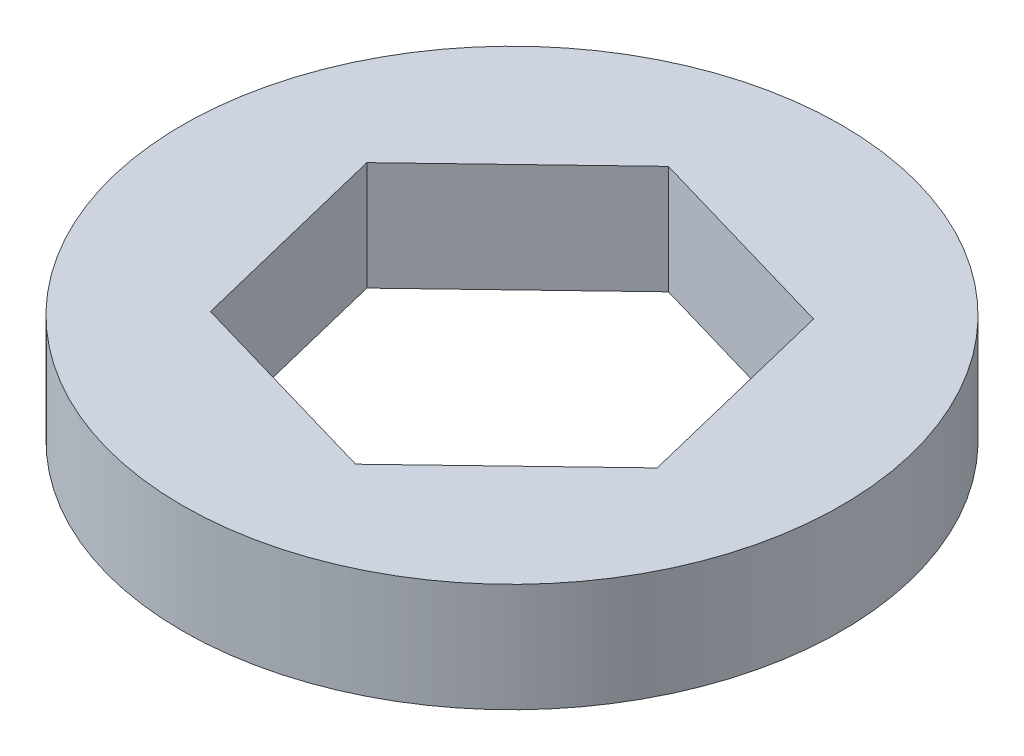
ISO-10303-21;
HEADER;
FILE_DESCRIPTION(('STEP AP214'),'2;1');
FILE_NAME('part.step','',(''),(''),'','','');
FILE_SCHEMA(('AUTOMOTIVE_DESIGN { 1 0 10303 214 1 1 1 1 }'));
ENDSEC;
DATA;
#1=APPLICATION_CONTEXT('core data for automotive mechanical design processes');
#2=APPLICATION_PROTOCOL_DEFINITION('international standard','automotive_design',2000,#1);
#3=PRODUCT_CONTEXT('',#1,'mechanical');
#4=PRODUCT('Part','Part','',(#3));
#5=PRODUCT_RELATED_PRODUCT_CATEGORY('part','',(#4));
#6=PRODUCT_DEFINITION_FORMATION('','',#4);
#7=PRODUCT_DEFINITION_CONTEXT('part definition',#1,'design');
#8=PRODUCT_DEFINITION('design','',#6,#7);
#9=PRODUCT_DEFINITION_SHAPE('','',#8);
#10=(LENGTH_UNIT() NAMED_UNIT(*) SI_UNIT(.MILLI.,.METRE.));
#11=(NAMED_UNIT(*) PLANE_ANGLE_UNIT() SI_UNIT($,.RADIAN.));
#12=(NAMED_UNIT(*) SI_UNIT($,.STERADIAN.) SOLID_ANGLE_UNIT());
#13=UNCERTAINTY_MEASURE_WITH_UNIT(LENGTH_MEASURE(1.E-05),#10,'distance_accuracy_value','');
#14=(GEOMETRIC_REPRESENTATION_CONTEXT(3) GLOBAL_UNCERTAINTY_ASSIGNED_CONTEXT((#13)) GLOBAL_UNIT_ASSIGNED_CONTEXT((#10,
#11,#12)) REPRESENTATION_CONTEXT('',''));
#15=CARTESIAN_POINT('',(0.,0.,0.));
#16=DIRECTION('',(0.,0.,1.));
#17=DIRECTION('',(1.,0.,0.));
#18=AXIS2_PLACEMENT_3D('',#15,#16,#17);
#19=CARTESIAN_POINT('',(0.,1.5,0.));
#20=DIRECTION('',(0.,-1.,0.));
#21=DIRECTION('',(0.,0.,-1.));
#22=AXIS2_PLACEMENT_3D('',#19,#20,#21);
#23=CYLINDRICAL_SURFACE('',#22,4.55);
#24=CARTESIAN_POINT('',(0.,1.5,0.));
#25=DIRECTION('',(0.,1.,0.));
#26=DIRECTION('',(0.,0.,1.));
#27=AXIS2_PLACEMENT_3D('',#24,#25,#26);
#28=CIRCLE('',#27,4.55);
#29=CARTESIAN_POINT('',(0.,1.5,4.55));
#30=VERTEX_POINT('',#29);
#31=EDGE_CURVE('E125',#30,#30,#28,.T.);
#32=ORIENTED_EDGE('',*,*,#31,.F.);
#33=EDGE_LOOP('',(#32));
#34=FACE_BOUND('',#33,.T.);
#35=CARTESIAN_POINT('',(0.,0.,0.));
#36=DIRECTION('',(0.,1.,0.));
#37=DIRECTION('',(0.,0.,1.));
#38=AXIS2_PLACEMENT_3D('',#35,#36,#37);
#39=CIRCLE('',#38,4.55);
#40=CARTESIAN_POINT('',(0.,0.,4.55));
#41=VERTEX_POINT('',#40);
#42=EDGE_CURVE('E118',#41,#41,#39,.T.);
#43=ORIENTED_EDGE('',*,*,#42,.T.);
#44=EDGE_LOOP('',(#43));
#45=FACE_BOUND('',#44,.T.);
#46=ADVANCED_FACE('F33',(#34,#45),#23,.T.);
#47=CARTESIAN_POINT('',(0.,1.5,0.));
#48=DIRECTION('',(0.,1.,0.));
#49=DIRECTION('',(0.,0.,1.));
#50=AXIS2_PLACEMENT_3D('',#47,#48,#49);
#51=PLANE('',#50);
#52=DIRECTION('',(0.237991419769063,0.,0.971267256792025));
#53=VECTOR('',#52,1.);
#54=CARTESIAN_POINT('',(-2.82711275100431,1.5,-0.82306348060695));
#55=LINE('',#54,#53);
#56=CARTESIAN_POINT('',(-2.82711275100431,1.5,-0.82306348060695));
#57=VERTEX_POINT('',#56);
#58=CARTESIAN_POINT('',(-2.12635025863502,1.5,2.03681972142917));
#59=VERTEX_POINT('',#58);
#60=EDGE_CURVE('E47',#57,#59,#55,.T.);
#61=ORIENTED_EDGE('',*,*,#60,.F.);
#62=DIRECTION('',(-0.722146408361386,0.,0.691740243798747));
#63=VECTOR('',#62,1.);
#64=CARTESIAN_POINT('',(-0.700762492369296,1.5,-2.85988320203612));
#65=LINE('',#64,#63);
#66=CARTESIAN_POINT('',(-0.700762492369296,1.5,-2.85988320203612));
#67=VERTEX_POINT('',#66);
#68=EDGE_CURVE('E113',#67,#57,#65,.T.);
#69=ORIENTED_EDGE('',*,*,#68,.F.);
#70=DIRECTION('',(-0.960137828130449,0.,-0.279527012993278));
#71=VECTOR('',#70,1.);
#72=CARTESIAN_POINT('',(2.12635025863501,1.5,-2.03681972142917));
#73=LINE('',#72,#71);
#74=CARTESIAN_POINT('',(2.12635025863501,1.5,-2.03681972142917));
#75=VERTEX_POINT('',#74);
#76=EDGE_CURVE('E107',#75,#67,#73,.T.);
#77=ORIENTED_EDGE('',*,*,#76,.F.);
#78=DIRECTION('',(-0.237991419769063,0.,-0.971267256792025));
#79=VECTOR('',#78,1.);
#80=CARTESIAN_POINT('',(2.82711275100431,1.5,0.823063480606951));
#81=LINE('',#80,#79);
#82=CARTESIAN_POINT('',(2.82711275100431,1.5,0.823063480606951));
#83=VERTEX_POINT('',#82);
#84=EDGE_CURVE('E105',#83,#75,#81,.T.);
#85=ORIENTED_EDGE('',*,*,#84,.F.);
#86=DIRECTION('',(0.722146408361386,0.,-0.691740243798747));
#87=VECTOR('',#86,1.);
#88=CARTESIAN_POINT('',(0.700762492369297,1.5,2.85988320203612));
#89=LINE('',#88,#87);
#90=CARTESIAN_POINT('',(0.700762492369297,1.5,2.85988320203612));
#91=VERTEX_POINT('',#90);
#92=EDGE_CURVE('E88',#91,#83,#89,.T.);
#93=ORIENTED_EDGE('',*,*,#92,.F.);
#94=DIRECTION('',(0.960137828130449,0.,0.279527012993278));
#95=VECTOR('',#94,1.);
#96=CARTESIAN_POINT('',(-2.12635025863502,1.5,2.03681972142917));
#97=LINE('',#96,#95);
#98=EDGE_CURVE('E97',#59,#91,#97,.T.);
#99=ORIENTED_EDGE('',*,*,#98,.F.);
#100=EDGE_LOOP('',(#61,#69,#77,#85,#93,#99));
#101=FACE_BOUND('',#100,.T.);
#102=ORIENTED_EDGE('',*,*,#31,.T.);
#103=EDGE_LOOP('',(#102));
#104=FACE_BOUND('',#103,.T.);
#105=ADVANCED_FACE('F101',(#101,#104),#51,.T.);
#106=CARTESIAN_POINT('',(0.,0.,0.));
#107=DIRECTION('',(0.,1.,0.));
#108=DIRECTION('',(0.,0.,1.));
#109=AXIS2_PLACEMENT_3D('',#106,#107,#108);
#110=PLANE('',#109);
#111=DIRECTION('',(-0.722146408361387,0.,0.691740243798747));
#112=VECTOR('',#111,1.);
#113=CARTESIAN_POINT('',(-1.7639376216868,0.,-1.84147334132154));
#114=LINE('',#113,#112);
#115=CARTESIAN_POINT('',(-0.700762492369296,0.,-2.85988320203612));
#116=VERTEX_POINT('',#115);
#117=CARTESIAN_POINT('',(-2.82711275100431,0.,-0.82306348060695));
#118=VERTEX_POINT('',#117);
#119=EDGE_CURVE('E40',#116,#118,#114,.T.);
#120=ORIENTED_EDGE('',*,*,#119,.T.);
#121=DIRECTION('',(0.237991419769063,0.,0.971267256792025));
#122=VECTOR('',#121,1.);
#123=CARTESIAN_POINT('',(-2.47673150481966,0.,0.60687812041111));
#124=LINE('',#123,#122);
#125=CARTESIAN_POINT('',(-2.12635025863502,0.,2.03681972142917));
#126=VERTEX_POINT('',#125);
#127=EDGE_CURVE('E11',#118,#126,#124,.T.);
#128=ORIENTED_EDGE('',*,*,#127,.T.);
#129=DIRECTION('',(0.960137828130449,0.,0.279527012993278));
#130=VECTOR('',#129,1.);
#131=CARTESIAN_POINT('',(-0.71279388313286,0.,2.44835146173264));
#132=LINE('',#131,#130);
#133=CARTESIAN_POINT('',(0.700762492369297,0.,2.85988320203612));
#134=VERTEX_POINT('',#133);
#135=EDGE_CURVE('E128',#126,#134,#132,.T.);
#136=ORIENTED_EDGE('',*,*,#135,.T.);
#137=DIRECTION('',(0.722146408361386,0.,-0.691740243798747));
#138=VECTOR('',#137,1.);
#139=CARTESIAN_POINT('',(1.7639376216868,0.,1.84147334132154));
#140=LINE('',#139,#138);
#141=CARTESIAN_POINT('',(2.82711275100431,0.,0.823063480606951));
#142=VERTEX_POINT('',#141);
#143=EDGE_CURVE('E91',#134,#142,#140,.T.);
#144=ORIENTED_EDGE('',*,*,#143,.T.);
#145=DIRECTION('',(-0.237991419769063,0.,-0.971267256792025));
#146=VECTOR('',#145,1.);
#147=CARTESIAN_POINT('',(2.47673150481966,0.,-0.60687812041111));
#148=LINE('',#147,#146);
#149=CARTESIAN_POINT('',(2.12635025863501,0.,-2.03681972142917));
#150=VERTEX_POINT('',#149);
#151=EDGE_CURVE('E133',#142,#150,#148,.T.);
#152=ORIENTED_EDGE('',*,*,#151,.T.);
#153=DIRECTION('',(-0.960137828130449,0.,-0.279527012993278));
#154=VECTOR('',#153,1.);
#155=CARTESIAN_POINT('',(0.71279388313286,0.,-2.44835146173264));
#156=LINE('',#155,#154);
#157=EDGE_CURVE('E136',#150,#116,#156,.T.);
#158=ORIENTED_EDGE('',*,*,#157,.T.);
#159=EDGE_LOOP('',(#120,#128,#136,#144,#152,#158));
#160=FACE_BOUND('',#159,.T.);
#161=ORIENTED_EDGE('',*,*,#42,.F.);
#162=EDGE_LOOP('',(#161));
#163=FACE_BOUND('',#162,.T.);
#164=ADVANCED_FACE('F140',(#160,#163),#110,.F.);
#165=CARTESIAN_POINT('',(-2.82711275100431,-13.5,-0.82306348060695));
#166=DIRECTION('',(-0.971267256792025,0.,0.237991419769063));
#167=DIRECTION('',(0.237991419769063,0.,0.971267256792025));
#168=AXIS2_PLACEMENT_3D('',#165,#166,#167);
#169=PLANE('',#168);
#170=DIRECTION('',(0.,1.,0.));
#171=VECTOR('',#170,1.);
#172=CARTESIAN_POINT('',(-2.82711275100431,-13.5,-0.82306348060695));
#173=LINE('',#172,#171);
#174=EDGE_CURVE('E116',#118,#57,#173,.T.);
#175=ORIENTED_EDGE('',*,*,#174,.T.);
#176=ORIENTED_EDGE('',*,*,#60,.T.);
#177=DIRECTION('',(0.,1.,0.));
#178=VECTOR('',#177,1.);
#179=CARTESIAN_POINT('',(-2.12635025863502,-13.5,2.03681972142917));
#180=LINE('',#179,#178);
#181=EDGE_CURVE('E94',#126,#59,#180,.T.);
#182=ORIENTED_EDGE('',*,*,#181,.F.);
#183=ORIENTED_EDGE('',*,*,#127,.F.);
#184=EDGE_LOOP('',(#175,#176,#182,#183));
#185=FACE_BOUND('',#184,.T.);
#186=ADVANCED_FACE('F152',(#185),#169,.F.);
#187=CARTESIAN_POINT('',(-0.700762492369296,-13.5,-2.85988320203612));
#188=DIRECTION('',(-0.691740243798747,0.,-0.722146408361387));
#189=DIRECTION('',(-0.722146408361387,0.,0.691740243798747));
#190=AXIS2_PLACEMENT_3D('',#187,#188,#189);
#191=PLANE('',#190);
#192=DIRECTION('',(0.,1.,0.));
#193=VECTOR('',#192,1.);
#194=CARTESIAN_POINT('',(-0.700762492369296,-13.5,-2.85988320203612));
#195=LINE('',#194,#193);
#196=EDGE_CURVE('E119',#116,#67,#195,.T.);
#197=ORIENTED_EDGE('',*,*,#196,.T.);
#198=ORIENTED_EDGE('',*,*,#68,.T.);
#199=ORIENTED_EDGE('',*,*,#174,.F.);
#200=ORIENTED_EDGE('',*,*,#119,.F.);
#201=EDGE_LOOP('',(#197,#198,#199,#200));
#202=FACE_BOUND('',#201,.T.);
#203=ADVANCED_FACE('F145',(#202),#191,.F.);
#204=CARTESIAN_POINT('',(2.12635025863501,-13.5,-2.03681972142917));
#205=DIRECTION('',(0.279527012993278,0.,-0.960137828130449));
#206=DIRECTION('',(-0.960137828130449,0.,-0.279527012993278));
#207=AXIS2_PLACEMENT_3D('',#204,#205,#206);
#208=PLANE('',#207);
#209=DIRECTION('',(0.,1.,0.));
#210=VECTOR('',#209,1.);
#211=CARTESIAN_POINT('',(2.12635025863501,-13.5,-2.03681972142917));
#212=LINE('',#211,#210);
#213=EDGE_CURVE('E121',#150,#75,#212,.T.);
#214=ORIENTED_EDGE('',*,*,#213,.T.);
#215=ORIENTED_EDGE('',*,*,#76,.T.);
#216=ORIENTED_EDGE('',*,*,#196,.F.);
#217=ORIENTED_EDGE('',*,*,#157,.F.);
#218=EDGE_LOOP('',(#214,#215,#216,#217));
#219=FACE_BOUND('',#218,.T.);
#220=ADVANCED_FACE('F147',(#219),#208,.F.);
#221=CARTESIAN_POINT('',(2.82711275100431,-13.5,0.823063480606951));
#222=DIRECTION('',(0.971267256792025,0.,-0.237991419769063));
#223=DIRECTION('',(-0.237991419769063,0.,-0.971267256792025));
#224=AXIS2_PLACEMENT_3D('',#221,#222,#223);
#225=PLANE('',#224);
#226=DIRECTION('',(0.,1.,0.));
#227=VECTOR('',#226,1.);
#228=CARTESIAN_POINT('',(2.82711275100431,-13.5,0.823063480606951));
#229=LINE('',#228,#227);
#230=EDGE_CURVE('E93',#142,#83,#229,.T.);
#231=ORIENTED_EDGE('',*,*,#230,.T.);
#232=ORIENTED_EDGE('',*,*,#84,.T.);
#233=ORIENTED_EDGE('',*,*,#213,.F.);
#234=ORIENTED_EDGE('',*,*,#151,.F.);
#235=EDGE_LOOP('',(#231,#232,#233,#234));
#236=FACE_BOUND('',#235,.T.);
#237=ADVANCED_FACE('F151',(#236),#225,.F.);
#238=CARTESIAN_POINT('',(0.700762492369297,-13.5,2.85988320203612));
#239=DIRECTION('',(0.691740243798747,0.,0.722146408361386));
#240=DIRECTION('',(0.722146408361386,0.,-0.691740243798747));
#241=AXIS2_PLACEMENT_3D('',#238,#239,#240);
#242=PLANE('',#241);
#243=DIRECTION('',(0.,1.,0.));
#244=VECTOR('',#243,1.);
#245=CARTESIAN_POINT('',(0.700762492369297,-13.5,2.85988320203612));
#246=LINE('',#245,#244);
#247=EDGE_CURVE('E55',#134,#91,#246,.T.);
#248=ORIENTED_EDGE('',*,*,#247,.T.);
#249=ORIENTED_EDGE('',*,*,#92,.T.);
#250=ORIENTED_EDGE('',*,*,#230,.F.);
#251=ORIENTED_EDGE('',*,*,#143,.F.);
#252=EDGE_LOOP('',(#248,#249,#250,#251));
#253=FACE_BOUND('',#252,.T.);
#254=ADVANCED_FACE('F85',(#253),#242,.F.);
#255=CARTESIAN_POINT('',(-2.12635025863502,-13.5,2.03681972142917));
#256=DIRECTION('',(-0.279527012993278,0.,0.960137828130449));
#257=DIRECTION('',(0.960137828130449,0.,0.279527012993278));
#258=AXIS2_PLACEMENT_3D('',#255,#256,#257);
#259=PLANE('',#258);
#260=ORIENTED_EDGE('',*,*,#181,.T.);
#261=ORIENTED_EDGE('',*,*,#98,.T.);
#262=ORIENTED_EDGE('',*,*,#247,.F.);
#263=ORIENTED_EDGE('',*,*,#135,.F.);
#264=EDGE_LOOP('',(#260,#261,#262,#263));
#265=FACE_BOUND('',#264,.T.);
#266=ADVANCED_FACE('F98',(#265),#259,.F.);
#267=CLOSED_SHELL('',(#46,#105,#164,#186,#203,#220,#237,#254,#266));
#268=MANIFOLD_SOLID_BREP('B2',#267);
#269=ADVANCED_BREP_SHAPE_REPRESENTATION('',(#18,#268),#14);
#270=SHAPE_DEFINITION_REPRESENTATION(#9,#269);
ENDSEC;
END-ISO-10303-21;
